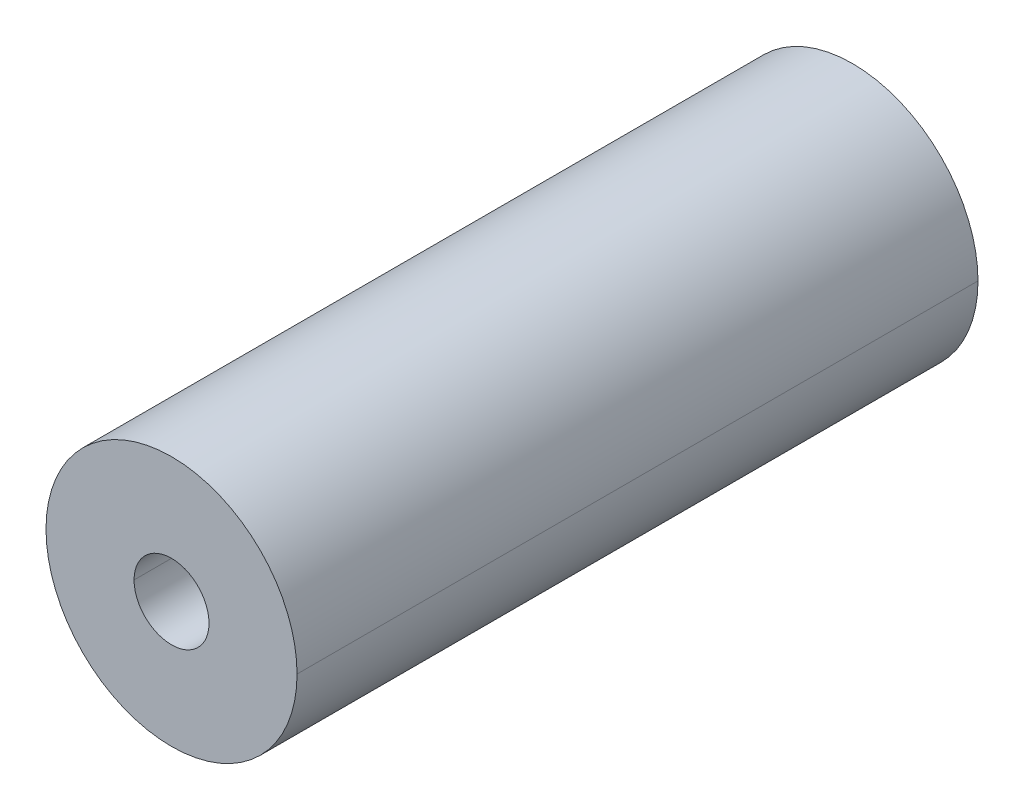
ISO-10303-21;
HEADER;
FILE_DESCRIPTION(('STEP AP214'),'2;1');
FILE_NAME('part.step','',(''),(''),'','','');
FILE_SCHEMA(('AUTOMOTIVE_DESIGN { 1 0 10303 214 1 1 1 1 }'));
ENDSEC;
DATA;
#1=APPLICATION_CONTEXT('core data for automotive mechanical design processes');
#2=APPLICATION_PROTOCOL_DEFINITION('international standard','automotive_design',2000,#1);
#3=PRODUCT_CONTEXT('',#1,'mechanical');
#4=PRODUCT('Part','Part','',(#3));
#5=PRODUCT_RELATED_PRODUCT_CATEGORY('part','',(#4));
#6=PRODUCT_DEFINITION_FORMATION('','',#4);
#7=PRODUCT_DEFINITION_CONTEXT('part definition',#1,'design');
#8=PRODUCT_DEFINITION('design','',#6,#7);
#9=PRODUCT_DEFINITION_SHAPE('','',#8);
#10=(LENGTH_UNIT() NAMED_UNIT(*) SI_UNIT(.MILLI.,.METRE.));
#11=(NAMED_UNIT(*) PLANE_ANGLE_UNIT() SI_UNIT($,.RADIAN.));
#12=(NAMED_UNIT(*) SI_UNIT($,.STERADIAN.) SOLID_ANGLE_UNIT());
#13=UNCERTAINTY_MEASURE_WITH_UNIT(LENGTH_MEASURE(1.E-05),#10,'distance_accuracy_value','');
#14=(GEOMETRIC_REPRESENTATION_CONTEXT(3) GLOBAL_UNCERTAINTY_ASSIGNED_CONTEXT((#13)) GLOBAL_UNIT_ASSIGNED_CONTEXT((#10,
#11,#12)) REPRESENTATION_CONTEXT('',''));
#15=CARTESIAN_POINT('',(0.,0.,0.));
#16=DIRECTION('',(0.,0.,1.));
#17=DIRECTION('',(1.,0.,0.));
#18=AXIS2_PLACEMENT_3D('',#15,#16,#17);
#19=CARTESIAN_POINT('',(0.,0.,-1.5));
#20=DIRECTION('',(0.,0.,1.));
#21=DIRECTION('',(1.,0.,0.));
#22=AXIS2_PLACEMENT_3D('',#19,#20,#21);
#23=CYLINDRICAL_SURFACE('',#22,0.63505);
#24=CARTESIAN_POINT('',(0.,0.,-1.5));
#25=DIRECTION('',(0.,0.,-1.));
#26=DIRECTION('',(1.,0.,0.));
#27=AXIS2_PLACEMENT_3D('',#24,#25,#26);
#28=CIRCLE('',#27,0.63505);
#29=CARTESIAN_POINT('',(0.63505,0.,-1.5));
#30=VERTEX_POINT('',#29);
#31=CARTESIAN_POINT('',(-0.63505,0.,-1.5));
#32=VERTEX_POINT('',#31);
#33=EDGE_CURVE('E11',#30,#32,#28,.T.);
#34=ORIENTED_EDGE('',*,*,#33,.T.);
#35=DIRECTION('',(0.,0.,1.));
#36=VECTOR('',#35,1.);
#37=CARTESIAN_POINT('',(-0.63505,0.,-1.5));
#38=LINE('',#37,#36);
#39=CARTESIAN_POINT('',(-0.63505,0.,10.0396));
#40=VERTEX_POINT('',#39);
#41=EDGE_CURVE('E28',#32,#40,#38,.T.);
#42=ORIENTED_EDGE('',*,*,#41,.T.);
#43=CARTESIAN_POINT('',(0.,0.,10.0396));
#44=DIRECTION('',(0.,0.,1.));
#45=DIRECTION('',(1.,0.,0.));
#46=AXIS2_PLACEMENT_3D('',#43,#44,#45);
#47=CIRCLE('',#46,0.63505);
#48=CARTESIAN_POINT('',(0.63505,0.,10.0396));
#49=VERTEX_POINT('',#48);
#50=EDGE_CURVE('E83',#40,#49,#47,.T.);
#51=ORIENTED_EDGE('',*,*,#50,.T.);
#52=DIRECTION('',(0.,0.,1.));
#53=VECTOR('',#52,1.);
#54=CARTESIAN_POINT('',(0.63505,0.,-1.5));
#55=LINE('',#54,#53);
#56=EDGE_CURVE('E98',#30,#49,#55,.T.);
#57=ORIENTED_EDGE('',*,*,#56,.F.);
#58=EDGE_LOOP('',(#34,#42,#51,#57));
#59=FACE_BOUND('',#58,.T.);
#60=ADVANCED_FACE('F17',(#59),#23,.F.);
#61=CARTESIAN_POINT('',(0.,0.,-1.5));
#62=DIRECTION('',(0.,0.,1.));
#63=DIRECTION('',(-1.,0.,0.));
#64=AXIS2_PLACEMENT_3D('',#61,#62,#63);
#65=CYLINDRICAL_SURFACE('',#64,2.1272);
#66=CARTESIAN_POINT('',(0.,0.,-1.5));
#67=DIRECTION('',(0.,0.,1.));
#68=DIRECTION('',(-1.,0.,0.));
#69=AXIS2_PLACEMENT_3D('',#66,#67,#68);
#70=CIRCLE('',#69,2.1272);
#71=CARTESIAN_POINT('',(-2.1272,0.,-1.5));
#72=VERTEX_POINT('',#71);
#73=CARTESIAN_POINT('',(2.1272,0.,-1.5));
#74=VERTEX_POINT('',#73);
#75=EDGE_CURVE('E21',#72,#74,#70,.T.);
#76=ORIENTED_EDGE('',*,*,#75,.T.);
#77=DIRECTION('',(0.,0.,1.));
#78=VECTOR('',#77,1.);
#79=CARTESIAN_POINT('',(2.1272,0.,-1.5));
#80=LINE('',#79,#78);
#81=CARTESIAN_POINT('',(2.1272,0.,10.0396));
#82=VERTEX_POINT('',#81);
#83=EDGE_CURVE('E84',#74,#82,#80,.T.);
#84=ORIENTED_EDGE('',*,*,#83,.T.);
#85=CARTESIAN_POINT('',(0.,0.,10.0396));
#86=DIRECTION('',(0.,0.,1.));
#87=DIRECTION('',(1.,0.,0.));
#88=AXIS2_PLACEMENT_3D('',#85,#86,#87);
#89=CIRCLE('',#88,2.1272);
#90=CARTESIAN_POINT('',(-2.1272,0.,10.0396));
#91=VERTEX_POINT('',#90);
#92=EDGE_CURVE('E71',#91,#82,#89,.T.);
#93=ORIENTED_EDGE('',*,*,#92,.F.);
#94=DIRECTION('',(0.,0.,1.));
#95=VECTOR('',#94,1.);
#96=CARTESIAN_POINT('',(-2.1272,0.,-1.5));
#97=LINE('',#96,#95);
#98=EDGE_CURVE('E65',#72,#91,#97,.T.);
#99=ORIENTED_EDGE('',*,*,#98,.F.);
#100=EDGE_LOOP('',(#76,#84,#93,#99));
#101=FACE_BOUND('',#100,.T.);
#102=ADVANCED_FACE('F67',(#101),#65,.T.);
#103=CARTESIAN_POINT('',(0.,0.,-1.5));
#104=DIRECTION('',(0.,0.,1.));
#105=DIRECTION('',(-1.,0.,0.));
#106=AXIS2_PLACEMENT_3D('',#103,#104,#105);
#107=CYLINDRICAL_SURFACE('',#106,2.1272);
#108=ORIENTED_EDGE('',*,*,#83,.F.);
#109=CARTESIAN_POINT('',(0.,0.,-1.5));
#110=DIRECTION('',(0.,0.,1.));
#111=DIRECTION('',(-1.,0.,0.));
#112=AXIS2_PLACEMENT_3D('',#109,#110,#111);
#113=CIRCLE('',#112,2.1272);
#114=EDGE_CURVE('E77',#74,#72,#113,.T.);
#115=ORIENTED_EDGE('',*,*,#114,.T.);
#116=ORIENTED_EDGE('',*,*,#98,.T.);
#117=CARTESIAN_POINT('',(0.,0.,10.0396));
#118=DIRECTION('',(0.,0.,1.));
#119=DIRECTION('',(1.,0.,0.));
#120=AXIS2_PLACEMENT_3D('',#117,#118,#119);
#121=CIRCLE('',#120,2.1272);
#122=EDGE_CURVE('E95',#82,#91,#121,.T.);
#123=ORIENTED_EDGE('',*,*,#122,.F.);
#124=EDGE_LOOP('',(#108,#115,#116,#123));
#125=FACE_BOUND('',#124,.T.);
#126=ADVANCED_FACE('F85',(#125),#107,.T.);
#127=CARTESIAN_POINT('',(0.,0.,-1.5));
#128=DIRECTION('',(0.,0.,1.));
#129=DIRECTION('',(1.,0.,0.));
#130=AXIS2_PLACEMENT_3D('',#127,#128,#129);
#131=PLANE('',#130);
#132=ORIENTED_EDGE('',*,*,#75,.F.);
#133=ORIENTED_EDGE('',*,*,#114,.F.);
#134=EDGE_LOOP('',(#132,#133));
#135=FACE_BOUND('',#134,.T.);
#136=ORIENTED_EDGE('',*,*,#33,.F.);
#137=CARTESIAN_POINT('',(0.,0.,-1.5));
#138=DIRECTION('',(0.,0.,-1.));
#139=DIRECTION('',(1.,0.,0.));
#140=AXIS2_PLACEMENT_3D('',#137,#138,#139);
#141=CIRCLE('',#140,0.63505);
#142=EDGE_CURVE('E78',#32,#30,#141,.T.);
#143=ORIENTED_EDGE('',*,*,#142,.F.);
#144=EDGE_LOOP('',(#136,#143));
#145=FACE_BOUND('',#144,.T.);
#146=ADVANCED_FACE('F19',(#135,#145),#131,.F.);
#147=CARTESIAN_POINT('',(0.,0.,-1.5));
#148=DIRECTION('',(0.,0.,1.));
#149=DIRECTION('',(1.,0.,0.));
#150=AXIS2_PLACEMENT_3D('',#147,#148,#149);
#151=CYLINDRICAL_SURFACE('',#150,0.63505);
#152=ORIENTED_EDGE('',*,*,#41,.F.);
#153=ORIENTED_EDGE('',*,*,#142,.T.);
#154=ORIENTED_EDGE('',*,*,#56,.T.);
#155=CARTESIAN_POINT('',(0.,0.,10.0396));
#156=DIRECTION('',(0.,0.,1.));
#157=DIRECTION('',(1.,0.,0.));
#158=AXIS2_PLACEMENT_3D('',#155,#156,#157);
#159=CIRCLE('',#158,0.63505);
#160=EDGE_CURVE('E101',#49,#40,#159,.T.);
#161=ORIENTED_EDGE('',*,*,#160,.T.);
#162=EDGE_LOOP('',(#152,#153,#154,#161));
#163=FACE_BOUND('',#162,.T.);
#164=ADVANCED_FACE('F158',(#163),#151,.F.);
#165=CARTESIAN_POINT('',(0.,0.,10.0396));
#166=DIRECTION('',(0.,0.,1.));
#167=DIRECTION('',(1.,0.,0.));
#168=AXIS2_PLACEMENT_3D('',#165,#166,#167);
#169=PLANE('',#168);
#170=ORIENTED_EDGE('',*,*,#92,.T.);
#171=ORIENTED_EDGE('',*,*,#122,.T.);
#172=EDGE_LOOP('',(#170,#171));
#173=FACE_BOUND('',#172,.T.);
#174=ORIENTED_EDGE('',*,*,#160,.F.);
#175=ORIENTED_EDGE('',*,*,#50,.F.);
#176=EDGE_LOOP('',(#174,#175));
#177=FACE_BOUND('',#176,.T.);
#178=ADVANCED_FACE('F111',(#173,#177),#169,.T.);
#179=CLOSED_SHELL('',(#60,#102,#126,#146,#164,#178));
#180=MANIFOLD_SOLID_BREP('B1',#179);
#181=ADVANCED_BREP_SHAPE_REPRESENTATION('',(#18,#180),#14);
#182=SHAPE_DEFINITION_REPRESENTATION(#9,#181);
ENDSEC;
END-ISO-10303-21;
